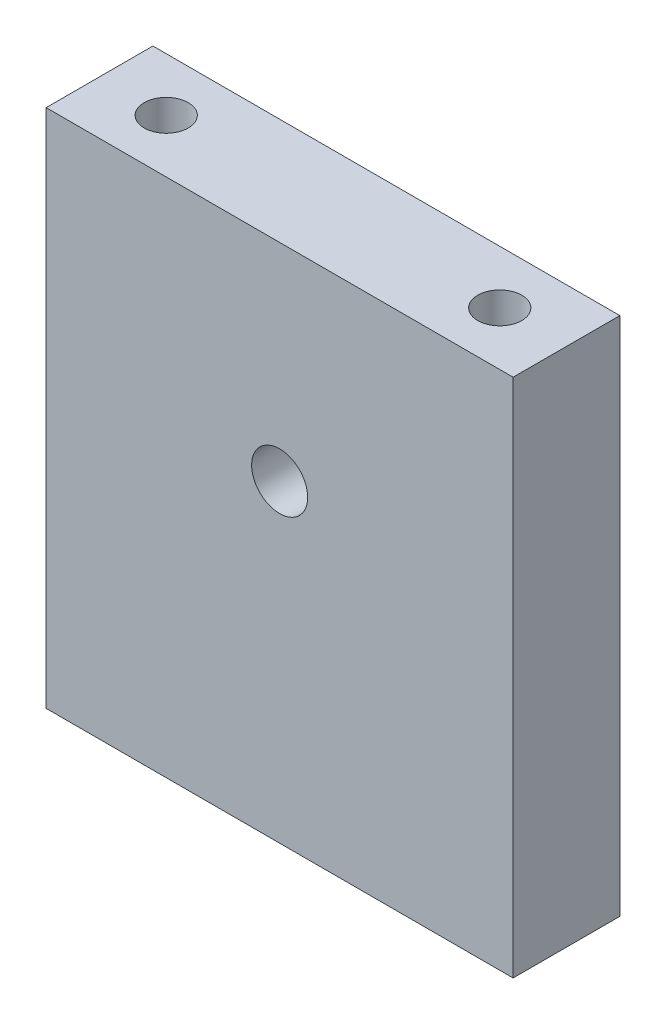
ISO-10303-21;
HEADER;
FILE_DESCRIPTION(('STEP AP214'),'2;1');
FILE_NAME('part.step','',(''),(''),'','','');
FILE_SCHEMA(('AUTOMOTIVE_DESIGN { 1 0 10303 214 1 1 1 1 }'));
ENDSEC;
DATA;
#1=APPLICATION_CONTEXT('core data for automotive mechanical design processes');
#2=APPLICATION_PROTOCOL_DEFINITION('international standard','automotive_design',2000,#1);
#3=PRODUCT_CONTEXT('',#1,'mechanical');
#4=PRODUCT('Part','Part','',(#3));
#5=PRODUCT_RELATED_PRODUCT_CATEGORY('part','',(#4));
#6=PRODUCT_DEFINITION_FORMATION('','',#4);
#7=PRODUCT_DEFINITION_CONTEXT('part definition',#1,'design');
#8=PRODUCT_DEFINITION('design','',#6,#7);
#9=PRODUCT_DEFINITION_SHAPE('','',#8);
#10=(LENGTH_UNIT() NAMED_UNIT(*) SI_UNIT(.MILLI.,.METRE.));
#11=(NAMED_UNIT(*) PLANE_ANGLE_UNIT() SI_UNIT($,.RADIAN.));
#12=(NAMED_UNIT(*) SI_UNIT($,.STERADIAN.) SOLID_ANGLE_UNIT());
#13=UNCERTAINTY_MEASURE_WITH_UNIT(LENGTH_MEASURE(1.E-05),#10,'distance_accuracy_value','');
#14=(GEOMETRIC_REPRESENTATION_CONTEXT(3) GLOBAL_UNCERTAINTY_ASSIGNED_CONTEXT((#13)) GLOBAL_UNIT_ASSIGNED_CONTEXT((#10,
#11,#12)) REPRESENTATION_CONTEXT('',''));
#15=CARTESIAN_POINT('',(0.,0.,0.));
#16=DIRECTION('',(0.,0.,1.));
#17=DIRECTION('',(1.,0.,0.));
#18=AXIS2_PLACEMENT_3D('',#15,#16,#17);
#19=CARTESIAN_POINT('',(0.,0.,8.));
#20=DIRECTION('',(0.,0.,-1.));
#21=DIRECTION('',(-1.,0.,0.));
#22=AXIS2_PLACEMENT_3D('',#19,#20,#21);
#23=PLANE('',#22);
#24=DIRECTION('',(0.,-1.,0.));
#25=VECTOR('',#24,1.);
#26=CARTESIAN_POINT('',(0.,0.,8.));
#27=LINE('',#26,#25);
#28=CARTESIAN_POINT('',(0.,39.,8.));
#29=VERTEX_POINT('',#28);
#30=CARTESIAN_POINT('',(0.,0.,8.));
#31=VERTEX_POINT('',#30);
#32=EDGE_CURVE('E88',#29,#31,#27,.T.);
#33=ORIENTED_EDGE('',*,*,#32,.T.);
#34=DIRECTION('',(1.,0.,0.));
#35=VECTOR('',#34,1.);
#36=CARTESIAN_POINT('',(0.,0.,8.));
#37=LINE('',#36,#35);
#38=CARTESIAN_POINT('',(35.,0.,8.));
#39=VERTEX_POINT('',#38);
#40=EDGE_CURVE('E83',#31,#39,#37,.T.);
#41=ORIENTED_EDGE('',*,*,#40,.T.);
#42=DIRECTION('',(0.,1.,0.));
#43=VECTOR('',#42,1.);
#44=CARTESIAN_POINT('',(35.,0.,8.));
#45=LINE('',#44,#43);
#46=CARTESIAN_POINT('',(35.,39.,8.));
#47=VERTEX_POINT('',#46);
#48=EDGE_CURVE('E86',#39,#47,#45,.T.);
#49=ORIENTED_EDGE('',*,*,#48,.T.);
#50=DIRECTION('',(-1.,0.,0.));
#51=VECTOR('',#50,1.);
#52=CARTESIAN_POINT('',(0.,39.,8.));
#53=LINE('',#52,#51);
#54=EDGE_CURVE('E53',#47,#29,#53,.T.);
#55=ORIENTED_EDGE('',*,*,#54,.T.);
#56=EDGE_LOOP('',(#33,#41,#49,#55));
#57=FACE_BOUND('',#56,.T.);
#58=CARTESIAN_POINT('',(17.5,23.5,8.));
#59=DIRECTION('',(0.,0.,1.));
#60=DIRECTION('',(1.,0.,0.));
#61=AXIS2_PLACEMENT_3D('',#58,#59,#60);
#62=CIRCLE('',#61,2.1);
#63=CARTESIAN_POINT('',(19.6,23.5,8.));
#64=VERTEX_POINT('',#63);
#65=EDGE_CURVE('E103',#64,#64,#62,.T.);
#66=ORIENTED_EDGE('',*,*,#65,.F.);
#67=EDGE_LOOP('',(#66));
#68=FACE_BOUND('',#67,.T.);
#69=ADVANCED_FACE('F36',(#57,#68),#23,.F.);
#70=CARTESIAN_POINT('',(0.,0.,0.));
#71=DIRECTION('',(0.,0.,-1.));
#72=DIRECTION('',(-1.,0.,0.));
#73=AXIS2_PLACEMENT_3D('',#70,#71,#72);
#74=PLANE('',#73);
#75=DIRECTION('',(0.,-1.,0.));
#76=VECTOR('',#75,1.);
#77=CARTESIAN_POINT('',(0.,0.,0.));
#78=LINE('',#77,#76);
#79=CARTESIAN_POINT('',(0.,39.,0.));
#80=VERTEX_POINT('',#79);
#81=CARTESIAN_POINT('',(0.,0.,0.));
#82=VERTEX_POINT('',#81);
#83=EDGE_CURVE('E100',#80,#82,#78,.T.);
#84=ORIENTED_EDGE('',*,*,#83,.F.);
#85=DIRECTION('',(-1.,0.,0.));
#86=VECTOR('',#85,1.);
#87=CARTESIAN_POINT('',(0.,39.,0.));
#88=LINE('',#87,#86);
#89=CARTESIAN_POINT('',(35.,39.,0.));
#90=VERTEX_POINT('',#89);
#91=EDGE_CURVE('E76',#90,#80,#88,.T.);
#92=ORIENTED_EDGE('',*,*,#91,.F.);
#93=DIRECTION('',(0.,1.,0.));
#94=VECTOR('',#93,1.);
#95=CARTESIAN_POINT('',(35.,0.,0.));
#96=LINE('',#95,#94);
#97=CARTESIAN_POINT('',(35.,0.,0.));
#98=VERTEX_POINT('',#97);
#99=EDGE_CURVE('E70',#98,#90,#96,.T.);
#100=ORIENTED_EDGE('',*,*,#99,.F.);
#101=DIRECTION('',(1.,0.,0.));
#102=VECTOR('',#101,1.);
#103=CARTESIAN_POINT('',(0.,0.,0.));
#104=LINE('',#103,#102);
#105=EDGE_CURVE('E92',#82,#98,#104,.T.);
#106=ORIENTED_EDGE('',*,*,#105,.F.);
#107=EDGE_LOOP('',(#84,#92,#100,#106));
#108=FACE_BOUND('',#107,.T.);
#109=CARTESIAN_POINT('',(17.5,23.5,0.));
#110=DIRECTION('',(0.,0.,1.));
#111=DIRECTION('',(1.,0.,0.));
#112=AXIS2_PLACEMENT_3D('',#109,#110,#111);
#113=CIRCLE('',#112,2.1);
#114=CARTESIAN_POINT('',(19.6,23.5,0.));
#115=VERTEX_POINT('',#114);
#116=EDGE_CURVE('E115',#115,#115,#113,.T.);
#117=ORIENTED_EDGE('',*,*,#116,.T.);
#118=EDGE_LOOP('',(#117));
#119=FACE_BOUND('',#118,.T.);
#120=ADVANCED_FACE('F111',(#108,#119),#74,.T.);
#121=CARTESIAN_POINT('',(0.,0.,8.));
#122=DIRECTION('',(1.,0.,0.));
#123=DIRECTION('',(0.,0.,-1.));
#124=AXIS2_PLACEMENT_3D('',#121,#122,#123);
#125=PLANE('',#124);
#126=ORIENTED_EDGE('',*,*,#83,.T.);
#127=DIRECTION('',(0.,0.,-1.));
#128=VECTOR('',#127,1.);
#129=CARTESIAN_POINT('',(0.,0.,8.));
#130=LINE('',#129,#128);
#131=EDGE_CURVE('E11',#31,#82,#130,.T.);
#132=ORIENTED_EDGE('',*,*,#131,.F.);
#133=ORIENTED_EDGE('',*,*,#32,.F.);
#134=DIRECTION('',(0.,0.,-1.));
#135=VECTOR('',#134,1.);
#136=CARTESIAN_POINT('',(0.,39.,8.));
#137=LINE('',#136,#135);
#138=EDGE_CURVE('E96',#29,#80,#137,.T.);
#139=ORIENTED_EDGE('',*,*,#138,.T.);
#140=EDGE_LOOP('',(#126,#132,#133,#139));
#141=FACE_BOUND('',#140,.T.);
#142=ADVANCED_FACE('F38',(#141),#125,.F.);
#143=CARTESIAN_POINT('',(0.,0.,8.));
#144=DIRECTION('',(0.,1.,0.));
#145=DIRECTION('',(0.,0.,1.));
#146=AXIS2_PLACEMENT_3D('',#143,#144,#145);
#147=PLANE('',#146);
#148=CARTESIAN_POINT('',(5.,0.,4.));
#149=DIRECTION('',(0.,1.,0.));
#150=DIRECTION('',(0.,0.,1.));
#151=AXIS2_PLACEMENT_3D('',#148,#149,#150);
#152=CIRCLE('',#151,1.65);
#153=CARTESIAN_POINT('',(5.,0.,5.65));
#154=VERTEX_POINT('',#153);
#155=EDGE_CURVE('E118',#154,#154,#152,.T.);
#156=ORIENTED_EDGE('',*,*,#155,.T.);
#157=EDGE_LOOP('',(#156));
#158=FACE_BOUND('',#157,.T.);
#159=CARTESIAN_POINT('',(30.,0.,4.));
#160=DIRECTION('',(0.,1.,0.));
#161=DIRECTION('',(0.,0.,1.));
#162=AXIS2_PLACEMENT_3D('',#159,#160,#161);
#163=CIRCLE('',#162,1.65);
#164=CARTESIAN_POINT('',(30.,0.,5.65));
#165=VERTEX_POINT('',#164);
#166=EDGE_CURVE('E124',#165,#165,#163,.T.);
#167=ORIENTED_EDGE('',*,*,#166,.T.);
#168=EDGE_LOOP('',(#167));
#169=FACE_BOUND('',#168,.T.);
#170=ORIENTED_EDGE('',*,*,#105,.T.);
#171=DIRECTION('',(0.,0.,-1.));
#172=VECTOR('',#171,1.);
#173=CARTESIAN_POINT('',(35.,0.,8.));
#174=LINE('',#173,#172);
#175=EDGE_CURVE('E45',#39,#98,#174,.T.);
#176=ORIENTED_EDGE('',*,*,#175,.F.);
#177=ORIENTED_EDGE('',*,*,#40,.F.);
#178=ORIENTED_EDGE('',*,*,#131,.T.);
#179=EDGE_LOOP('',(#170,#176,#177,#178));
#180=FACE_BOUND('',#179,.T.);
#181=ADVANCED_FACE('F91',(#158,#169,#180),#147,.F.);
#182=CARTESIAN_POINT('',(35.,0.,8.));
#183=DIRECTION('',(-1.,0.,0.));
#184=DIRECTION('',(0.,0.,1.));
#185=AXIS2_PLACEMENT_3D('',#182,#183,#184);
#186=PLANE('',#185);
#187=ORIENTED_EDGE('',*,*,#99,.T.);
#188=DIRECTION('',(0.,0.,-1.));
#189=VECTOR('',#188,1.);
#190=CARTESIAN_POINT('',(35.,39.,8.));
#191=LINE('',#190,#189);
#192=EDGE_CURVE('E93',#47,#90,#191,.T.);
#193=ORIENTED_EDGE('',*,*,#192,.F.);
#194=ORIENTED_EDGE('',*,*,#48,.F.);
#195=ORIENTED_EDGE('',*,*,#175,.T.);
#196=EDGE_LOOP('',(#187,#193,#194,#195));
#197=FACE_BOUND('',#196,.T.);
#198=ADVANCED_FACE('F94',(#197),#186,.F.);
#199=CARTESIAN_POINT('',(0.,39.,8.));
#200=DIRECTION('',(0.,-1.,0.));
#201=DIRECTION('',(0.,0.,-1.));
#202=AXIS2_PLACEMENT_3D('',#199,#200,#201);
#203=PLANE('',#202);
#204=CARTESIAN_POINT('',(5.,39.,4.));
#205=DIRECTION('',(0.,1.,0.));
#206=DIRECTION('',(0.,0.,1.));
#207=AXIS2_PLACEMENT_3D('',#204,#205,#206);
#208=CIRCLE('',#207,1.65);
#209=CARTESIAN_POINT('',(5.,39.,5.65));
#210=VERTEX_POINT('',#209);
#211=EDGE_CURVE('E127',#210,#210,#208,.T.);
#212=ORIENTED_EDGE('',*,*,#211,.F.);
#213=EDGE_LOOP('',(#212));
#214=FACE_BOUND('',#213,.T.);
#215=CARTESIAN_POINT('',(30.,39.,4.));
#216=DIRECTION('',(0.,1.,0.));
#217=DIRECTION('',(0.,0.,1.));
#218=AXIS2_PLACEMENT_3D('',#215,#216,#217);
#219=CIRCLE('',#218,1.65);
#220=CARTESIAN_POINT('',(30.,39.,5.65));
#221=VERTEX_POINT('',#220);
#222=EDGE_CURVE('E121',#221,#221,#219,.T.);
#223=ORIENTED_EDGE('',*,*,#222,.F.);
#224=EDGE_LOOP('',(#223));
#225=FACE_BOUND('',#224,.T.);
#226=ORIENTED_EDGE('',*,*,#91,.T.);
#227=ORIENTED_EDGE('',*,*,#138,.F.);
#228=ORIENTED_EDGE('',*,*,#54,.F.);
#229=ORIENTED_EDGE('',*,*,#192,.T.);
#230=EDGE_LOOP('',(#226,#227,#228,#229));
#231=FACE_BOUND('',#230,.T.);
#232=ADVANCED_FACE('F108',(#214,#225,#231),#203,.F.);
#233=CARTESIAN_POINT('',(17.5,23.5,8.));
#234=DIRECTION('',(0.,0.,-1.));
#235=DIRECTION('',(-1.,0.,0.));
#236=AXIS2_PLACEMENT_3D('',#233,#234,#235);
#237=CYLINDRICAL_SURFACE('',#236,2.1);
#238=ORIENTED_EDGE('',*,*,#65,.T.);
#239=EDGE_LOOP('',(#238));
#240=FACE_BOUND('',#239,.T.);
#241=ORIENTED_EDGE('',*,*,#116,.F.);
#242=EDGE_LOOP('',(#241));
#243=FACE_BOUND('',#242,.T.);
#244=ADVANCED_FACE('F144',(#240,#243),#237,.F.);
#245=CARTESIAN_POINT('',(30.,0.,4.));
#246=DIRECTION('',(0.,1.,0.));
#247=DIRECTION('',(0.,0.,1.));
#248=AXIS2_PLACEMENT_3D('',#245,#246,#247);
#249=CYLINDRICAL_SURFACE('',#248,1.65);
#250=ORIENTED_EDGE('',*,*,#166,.F.);
#251=EDGE_LOOP('',(#250));
#252=FACE_BOUND('',#251,.T.);
#253=ORIENTED_EDGE('',*,*,#222,.T.);
#254=EDGE_LOOP('',(#253));
#255=FACE_BOUND('',#254,.T.);
#256=ADVANCED_FACE('F138',(#252,#255),#249,.F.);
#257=CARTESIAN_POINT('',(5.,0.,4.));
#258=DIRECTION('',(0.,1.,0.));
#259=DIRECTION('',(0.,0.,1.));
#260=AXIS2_PLACEMENT_3D('',#257,#258,#259);
#261=CYLINDRICAL_SURFACE('',#260,1.65);
#262=ORIENTED_EDGE('',*,*,#155,.F.);
#263=EDGE_LOOP('',(#262));
#264=FACE_BOUND('',#263,.T.);
#265=ORIENTED_EDGE('',*,*,#211,.T.);
#266=EDGE_LOOP('',(#265));
#267=FACE_BOUND('',#266,.T.);
#268=ADVANCED_FACE('F135',(#264,#267),#261,.F.);
#269=CLOSED_SHELL('',(#69,#120,#142,#181,#198,#232,#244,#256,#268));
#270=MANIFOLD_SOLID_BREP('B2',#269);
#271=ADVANCED_BREP_SHAPE_REPRESENTATION('',(#18,#270),#14);
#272=SHAPE_DEFINITION_REPRESENTATION(#9,#271);
ENDSEC;
END-ISO-10303-21;
